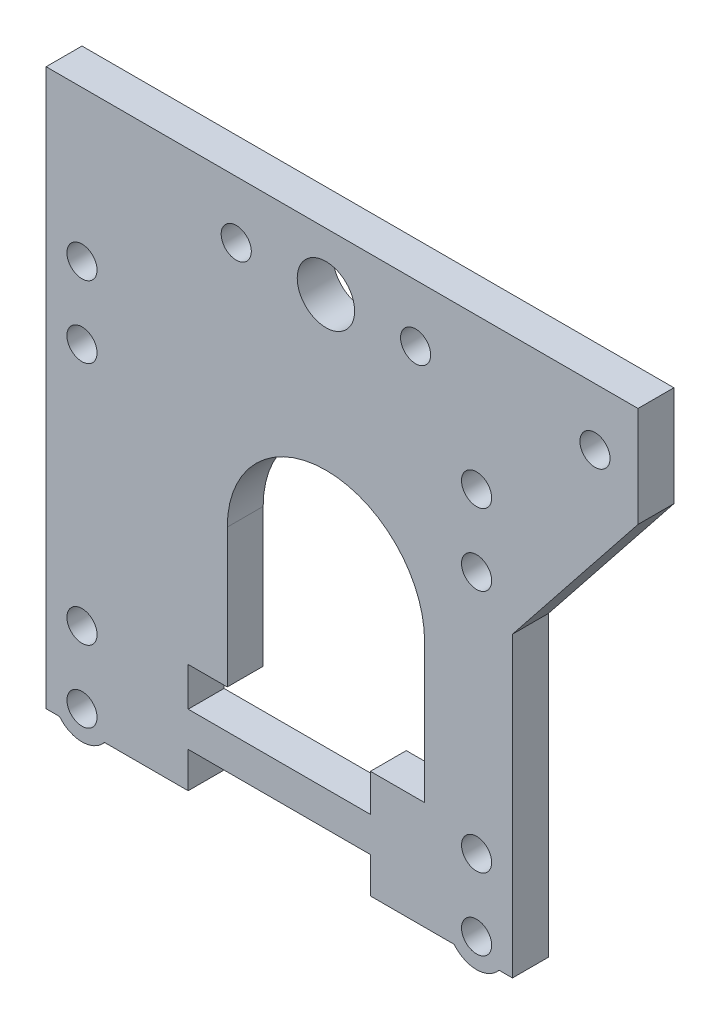
ISO-10303-21;
HEADER;
FILE_DESCRIPTION(('STEP AP214'),'2;1');
FILE_NAME('part.step','',(''),(''),'','','');
FILE_SCHEMA(('AUTOMOTIVE_DESIGN { 1 0 10303 214 1 1 1 1 }'));
ENDSEC;
DATA;
#1=APPLICATION_CONTEXT('core data for automotive mechanical design processes');
#2=APPLICATION_PROTOCOL_DEFINITION('international standard','automotive_design',2000,#1);
#3=PRODUCT_CONTEXT('',#1,'mechanical');
#4=PRODUCT('Part','Part','',(#3));
#5=PRODUCT_RELATED_PRODUCT_CATEGORY('part','',(#4));
#6=PRODUCT_DEFINITION_FORMATION('','',#4);
#7=PRODUCT_DEFINITION_CONTEXT('part definition',#1,'design');
#8=PRODUCT_DEFINITION('design','',#6,#7);
#9=PRODUCT_DEFINITION_SHAPE('','',#8);
#10=(LENGTH_UNIT() NAMED_UNIT(*) SI_UNIT(.MILLI.,.METRE.));
#11=(NAMED_UNIT(*) PLANE_ANGLE_UNIT() SI_UNIT($,.RADIAN.));
#12=(NAMED_UNIT(*) SI_UNIT($,.STERADIAN.) SOLID_ANGLE_UNIT());
#13=UNCERTAINTY_MEASURE_WITH_UNIT(LENGTH_MEASURE(1.E-05),#10,'distance_accuracy_value','');
#14=(GEOMETRIC_REPRESENTATION_CONTEXT(3) GLOBAL_UNCERTAINTY_ASSIGNED_CONTEXT((#13)) GLOBAL_UNIT_ASSIGNED_CONTEXT((#10,
#11,#12)) REPRESENTATION_CONTEXT('',''));
#15=CARTESIAN_POINT('',(0.,0.,0.));
#16=DIRECTION('',(0.,0.,1.));
#17=DIRECTION('',(1.,0.,0.));
#18=AXIS2_PLACEMENT_3D('',#15,#16,#17);
#19=CARTESIAN_POINT('',(-60.,2.5,5.));
#20=DIRECTION('',(0.,0.,1.));
#21=DIRECTION('',(1.,0.,0.));
#22=AXIS2_PLACEMENT_3D('',#19,#20,#21);
#23=PLANE('',#22);
#24=DIRECTION('',(0.,1.,0.));
#25=VECTOR('',#24,1.);
#26=CARTESIAN_POINT('',(-19.8,2.5,5.));
#27=LINE('',#26,#25);
#28=CARTESIAN_POINT('',(-19.8,0.,5.));
#29=VERTEX_POINT('',#28);
#30=CARTESIAN_POINT('',(-19.8,5.,5.));
#31=VERTEX_POINT('',#30);
#32=EDGE_CURVE('E433',#29,#31,#27,.T.);
#33=ORIENTED_EDGE('',*,*,#32,.F.);
#34=DIRECTION('',(1.,0.,0.));
#35=VECTOR('',#34,1.);
#36=CARTESIAN_POINT('',(-20.,0.,5.));
#37=LINE('',#36,#35);
#38=CARTESIAN_POINT('',(-8.12249899919918,0.,5.));
#39=VERTEX_POINT('',#38);
#40=EDGE_CURVE('E350',#29,#39,#37,.T.);
#41=ORIENTED_EDGE('',*,*,#40,.T.);
#42=CARTESIAN_POINT('',(-4.99999999999998,2.5,5.));
#43=DIRECTION('',(0.,0.,1.));
#44=DIRECTION('',(1.,0.,0.));
#45=AXIS2_PLACEMENT_3D('',#42,#43,#44);
#46=CIRCLE('',#45,4.);
#47=CARTESIAN_POINT('',(-1.87750100080077,0.,5.));
#48=VERTEX_POINT('',#47);
#49=EDGE_CURVE('E352',#39,#48,#46,.T.);
#50=ORIENTED_EDGE('',*,*,#49,.T.);
#51=DIRECTION('',(1.,0.,0.));
#52=VECTOR('',#51,1.);
#53=CARTESIAN_POINT('',(-1.87750100080077,0.,5.));
#54=LINE('',#53,#52);
#55=CARTESIAN_POINT('',(0.,0.,5.));
#56=VERTEX_POINT('',#55);
#57=EDGE_CURVE('E354',#48,#56,#54,.T.);
#58=ORIENTED_EDGE('',*,*,#57,.T.);
#59=DIRECTION('',(0.,1.,0.));
#60=VECTOR('',#59,1.);
#61=CARTESIAN_POINT('',(0.,61.5,5.));
#62=LINE('',#61,#60);
#63=CARTESIAN_POINT('',(0.,41.5,5.));
#64=VERTEX_POINT('',#63);
#65=EDGE_CURVE('E229',#56,#64,#62,.T.);
#66=ORIENTED_EDGE('',*,*,#65,.T.);
#67=DIRECTION('',(-0.622523565821538,-0.782601054175649,0.));
#68=VECTOR('',#67,1.);
#69=CARTESIAN_POINT('',(-7.63278329429795E-13,41.5,5.));
#70=LINE('',#69,#68);
#71=CARTESIAN_POINT('',(17.4999999999992,63.5,5.));
#72=VERTEX_POINT('',#71);
#73=EDGE_CURVE('E392',#72,#64,#70,.T.);
#74=ORIENTED_EDGE('',*,*,#73,.F.);
#75=DIRECTION('',(0.,-1.,0.));
#76=VECTOR('',#75,1.);
#77=CARTESIAN_POINT('',(17.4999999999992,63.5,5.));
#78=LINE('',#77,#76);
#79=CARTESIAN_POINT('',(17.4999999999984,77.4999999999999,5.));
#80=VERTEX_POINT('',#79);
#81=EDGE_CURVE('E401',#80,#72,#78,.T.);
#82=ORIENTED_EDGE('',*,*,#81,.F.);
#83=DIRECTION('',(1.,0.,0.));
#84=VECTOR('',#83,1.);
#85=CARTESIAN_POINT('',(-65.,77.4999999999999,5.));
#86=LINE('',#85,#84);
#87=CARTESIAN_POINT('',(-65.,77.4999999999999,5.));
#88=VERTEX_POINT('',#87);
#89=EDGE_CURVE('E371',#88,#80,#86,.T.);
#90=ORIENTED_EDGE('',*,*,#89,.F.);
#91=DIRECTION('',(0.,-1.,0.));
#92=VECTOR('',#91,1.);
#93=CARTESIAN_POINT('',(-65.,61.5,5.));
#94=LINE('',#93,#92);
#95=CARTESIAN_POINT('',(-65.,0.,5.));
#96=VERTEX_POINT('',#95);
#97=EDGE_CURVE('E224',#88,#96,#94,.T.);
#98=ORIENTED_EDGE('',*,*,#97,.T.);
#99=DIRECTION('',(1.,0.,0.));
#100=VECTOR('',#99,1.);
#101=CARTESIAN_POINT('',(-65.,0.,5.));
#102=LINE('',#101,#100);
#103=CARTESIAN_POINT('',(-63.1224989991992,0.,5.));
#104=VERTEX_POINT('',#103);
#105=EDGE_CURVE('E342',#96,#104,#102,.T.);
#106=ORIENTED_EDGE('',*,*,#105,.T.);
#107=CARTESIAN_POINT('',(-60.,2.5,5.));
#108=DIRECTION('',(0.,0.,1.));
#109=DIRECTION('',(1.,0.,0.));
#110=AXIS2_PLACEMENT_3D('',#107,#108,#109);
#111=CIRCLE('',#110,4.);
#112=CARTESIAN_POINT('',(-56.8775010008008,0.,5.));
#113=VERTEX_POINT('',#112);
#114=EDGE_CURVE('E344',#104,#113,#111,.T.);
#115=ORIENTED_EDGE('',*,*,#114,.T.);
#116=DIRECTION('',(1.,0.,0.));
#117=VECTOR('',#116,1.);
#118=CARTESIAN_POINT('',(-56.8775010008008,0.,5.));
#119=LINE('',#118,#117);
#120=CARTESIAN_POINT('',(-45.2,0.,5.));
#121=VERTEX_POINT('',#120);
#122=EDGE_CURVE('E346',#113,#121,#119,.T.);
#123=ORIENTED_EDGE('',*,*,#122,.T.);
#124=DIRECTION('',(0.,-1.,0.));
#125=VECTOR('',#124,1.);
#126=CARTESIAN_POINT('',(-45.2,2.5,5.));
#127=LINE('',#126,#125);
#128=CARTESIAN_POINT('',(-45.2,5.,5.));
#129=VERTEX_POINT('',#128);
#130=EDGE_CURVE('E188',#129,#121,#127,.T.);
#131=ORIENTED_EDGE('',*,*,#130,.F.);
#132=DIRECTION('',(1.,0.,0.));
#133=VECTOR('',#132,1.);
#134=CARTESIAN_POINT('',(-45.,5.,5.));
#135=LINE('',#134,#133);
#136=EDGE_CURVE('E348',#129,#31,#135,.T.);
#137=ORIENTED_EDGE('',*,*,#136,.T.);
#138=EDGE_LOOP('',(#33,#41,#50,#58,#66,#74,#82,#90,#98,#106,#115,#123,#131,#137));
#139=FACE_BOUND('',#138,.T.);
#140=DIRECTION('',(0.,1.,0.));
#141=VECTOR('',#140,1.);
#142=CARTESIAN_POINT('',(-19.8,2.5,5.));
#143=LINE('',#142,#141);
#144=CARTESIAN_POINT('',(-19.8,9.85,5.));
#145=VERTEX_POINT('',#144);
#146=CARTESIAN_POINT('',(-19.8,15.05,5.));
#147=VERTEX_POINT('',#146);
#148=EDGE_CURVE('E260',#145,#147,#143,.T.);
#149=ORIENTED_EDGE('',*,*,#148,.F.);
#150=DIRECTION('',(1.,0.,0.));
#151=VECTOR('',#150,1.);
#152=CARTESIAN_POINT('',(-60.,9.85000000000001,5.));
#153=LINE('',#152,#151);
#154=CARTESIAN_POINT('',(-45.2,9.85000000000001,5.));
#155=VERTEX_POINT('',#154);
#156=EDGE_CURVE('E430',#155,#145,#153,.T.);
#157=ORIENTED_EDGE('',*,*,#156,.F.);
#158=DIRECTION('',(0.,-1.,0.));
#159=VECTOR('',#158,1.);
#160=CARTESIAN_POINT('',(-45.2,2.5,5.));
#161=LINE('',#160,#159);
#162=CARTESIAN_POINT('',(-45.2,15.25,5.));
#163=VERTEX_POINT('',#162);
#164=EDGE_CURVE('E426',#163,#155,#161,.T.);
#165=ORIENTED_EDGE('',*,*,#164,.F.);
#166=DIRECTION('',(-1.,0.,0.));
#167=VECTOR('',#166,1.);
#168=CARTESIAN_POINT('',(-60.,15.25,5.));
#169=LINE('',#168,#167);
#170=CARTESIAN_POINT('',(-39.7500000000015,15.25,5.));
#171=VERTEX_POINT('',#170);
#172=EDGE_CURVE('E437',#171,#163,#169,.T.);
#173=ORIENTED_EDGE('',*,*,#172,.F.);
#174=DIRECTION('',(0.,1.,0.));
#175=VECTOR('',#174,1.);
#176=CARTESIAN_POINT('',(-39.7500000000015,15.05,5.));
#177=LINE('',#176,#175);
#178=CARTESIAN_POINT('',(-39.7500000000015,34.55,5.));
#179=VERTEX_POINT('',#178);
#180=EDGE_CURVE('E264',#171,#179,#177,.T.);
#181=ORIENTED_EDGE('',*,*,#180,.T.);
#182=CARTESIAN_POINT('',(-26.0000000000015,34.55,5.));
#183=DIRECTION('',(0.,0.,-1.));
#184=DIRECTION('',(-1.,0.,0.));
#185=AXIS2_PLACEMENT_3D('',#182,#183,#184);
#186=CIRCLE('',#185,13.75);
#187=CARTESIAN_POINT('',(-12.2500000000015,34.55,5.));
#188=VERTEX_POINT('',#187);
#189=EDGE_CURVE('E267',#179,#188,#186,.T.);
#190=ORIENTED_EDGE('',*,*,#189,.T.);
#191=DIRECTION('',(0.,-1.,0.));
#192=VECTOR('',#191,1.);
#193=CARTESIAN_POINT('',(-12.2500000000015,34.55,5.));
#194=LINE('',#193,#192);
#195=CARTESIAN_POINT('',(-12.2500000000015,15.05,5.));
#196=VERTEX_POINT('',#195);
#197=EDGE_CURVE('E263',#188,#196,#194,.T.);
#198=ORIENTED_EDGE('',*,*,#197,.T.);
#199=DIRECTION('',(-1.,0.,0.));
#200=VECTOR('',#199,1.);
#201=CARTESIAN_POINT('',(-39.7500000000015,15.05,5.));
#202=LINE('',#201,#200);
#203=EDGE_CURVE('E249',#196,#147,#202,.T.);
#204=ORIENTED_EDGE('',*,*,#203,.T.);
#205=EDGE_LOOP('',(#149,#157,#165,#173,#181,#190,#198,#204));
#206=FACE_BOUND('',#205,.T.);
#207=CARTESIAN_POINT('',(-60.,2.5,5.));
#208=DIRECTION('',(0.,0.,1.));
#209=DIRECTION('',(-1.,0.,0.));
#210=AXIS2_PLACEMENT_3D('',#207,#208,#209);
#211=CIRCLE('',#210,2.1);
#212=CARTESIAN_POINT('',(-62.1,2.5,5.));
#213=VERTEX_POINT('',#212);
#214=EDGE_CURVE('E298',#213,#213,#211,.T.);
#215=ORIENTED_EDGE('',*,*,#214,.F.);
#216=EDGE_LOOP('',(#215));
#217=FACE_BOUND('',#216,.T.);
#218=CARTESIAN_POINT('',(-4.99999999999998,12.5,5.));
#219=DIRECTION('',(0.,0.,1.));
#220=DIRECTION('',(-1.,0.,0.));
#221=AXIS2_PLACEMENT_3D('',#218,#219,#220);
#222=CIRCLE('',#221,2.1);
#223=CARTESIAN_POINT('',(-7.09999999999998,12.5,5.));
#224=VERTEX_POINT('',#223);
#225=EDGE_CURVE('E310',#224,#224,#222,.T.);
#226=ORIENTED_EDGE('',*,*,#225,.F.);
#227=EDGE_LOOP('',(#226));
#228=FACE_BOUND('',#227,.T.);
#229=CARTESIAN_POINT('',(-60.,46.5,5.));
#230=DIRECTION('',(0.,0.,1.));
#231=DIRECTION('',(1.,0.,0.));
#232=AXIS2_PLACEMENT_3D('',#229,#230,#231);
#233=CIRCLE('',#232,2.1);
#234=CARTESIAN_POINT('',(-57.9,46.5,5.));
#235=VERTEX_POINT('',#234);
#236=EDGE_CURVE('E322',#235,#235,#233,.T.);
#237=ORIENTED_EDGE('',*,*,#236,.F.);
#238=EDGE_LOOP('',(#237));
#239=FACE_BOUND('',#238,.T.);
#240=CARTESIAN_POINT('',(-60.,56.5,5.));
#241=DIRECTION('',(0.,0.,1.));
#242=DIRECTION('',(1.,0.,0.));
#243=AXIS2_PLACEMENT_3D('',#240,#241,#242);
#244=CIRCLE('',#243,2.1);
#245=CARTESIAN_POINT('',(-57.9,56.5,5.));
#246=VERTEX_POINT('',#245);
#247=EDGE_CURVE('E334',#246,#246,#244,.T.);
#248=ORIENTED_EDGE('',*,*,#247,.F.);
#249=EDGE_LOOP('',(#248));
#250=FACE_BOUND('',#249,.T.);
#251=CARTESIAN_POINT('',(-5.,56.5,5.));
#252=DIRECTION('',(0.,0.,1.));
#253=DIRECTION('',(1.,0.,0.));
#254=AXIS2_PLACEMENT_3D('',#251,#252,#253);
#255=CIRCLE('',#254,2.1);
#256=CARTESIAN_POINT('',(-2.90000000000001,56.5,5.));
#257=VERTEX_POINT('',#256);
#258=EDGE_CURVE('E328',#257,#257,#255,.T.);
#259=ORIENTED_EDGE('',*,*,#258,.F.);
#260=EDGE_LOOP('',(#259));
#261=FACE_BOUND('',#260,.T.);
#262=CARTESIAN_POINT('',(-5.,46.5,5.));
#263=DIRECTION('',(0.,0.,1.));
#264=DIRECTION('',(1.,0.,0.));
#265=AXIS2_PLACEMENT_3D('',#262,#263,#264);
#266=CIRCLE('',#265,2.1);
#267=CARTESIAN_POINT('',(-2.90000000000001,46.5,5.));
#268=VERTEX_POINT('',#267);
#269=EDGE_CURVE('E316',#268,#268,#266,.T.);
#270=ORIENTED_EDGE('',*,*,#269,.F.);
#271=EDGE_LOOP('',(#270));
#272=FACE_BOUND('',#271,.T.);
#273=CARTESIAN_POINT('',(-4.99999999999998,2.5,5.));
#274=DIRECTION('',(0.,0.,1.));
#275=DIRECTION('',(-1.,0.,0.));
#276=AXIS2_PLACEMENT_3D('',#273,#274,#275);
#277=CIRCLE('',#276,2.1);
#278=CARTESIAN_POINT('',(-7.09999999999998,2.5,5.));
#279=VERTEX_POINT('',#278);
#280=EDGE_CURVE('E304',#279,#279,#277,.T.);
#281=ORIENTED_EDGE('',*,*,#280,.F.);
#282=EDGE_LOOP('',(#281));
#283=FACE_BOUND('',#282,.T.);
#284=CARTESIAN_POINT('',(-60.,12.5,5.));
#285=DIRECTION('',(0.,0.,1.));
#286=DIRECTION('',(-1.,0.,0.));
#287=AXIS2_PLACEMENT_3D('',#284,#285,#286);
#288=CIRCLE('',#287,2.1);
#289=CARTESIAN_POINT('',(-62.1,12.5,5.));
#290=VERTEX_POINT('',#289);
#291=EDGE_CURVE('E292',#290,#290,#288,.T.);
#292=ORIENTED_EDGE('',*,*,#291,.F.);
#293=EDGE_LOOP('',(#292));
#294=FACE_BOUND('',#293,.T.);
#295=CARTESIAN_POINT('',(-38.5000000000018,69.4999999999999,5.));
#296=DIRECTION('',(0.,0.,-1.));
#297=DIRECTION('',(-1.,0.,0.));
#298=AXIS2_PLACEMENT_3D('',#295,#296,#297);
#299=CIRCLE('',#298,2.09999999999847);
#300=CARTESIAN_POINT('',(-40.6000000000002,69.4999999999999,5.));
#301=VERTEX_POINT('',#300);
#302=EDGE_CURVE('E420',#301,#301,#299,.T.);
#303=ORIENTED_EDGE('',*,*,#302,.T.);
#304=EDGE_LOOP('',(#303));
#305=FACE_BOUND('',#304,.T.);
#306=CARTESIAN_POINT('',(-26.0000000000014,69.4999999999999,5.));
#307=DIRECTION('',(0.,0.,-1.));
#308=DIRECTION('',(-1.,0.,0.));
#309=AXIS2_PLACEMENT_3D('',#306,#307,#308);
#310=CIRCLE('',#309,3.99999999999847);
#311=CARTESIAN_POINT('',(-29.9999999999999,69.4999999999999,5.));
#312=VERTEX_POINT('',#311);
#313=EDGE_CURVE('E414',#312,#312,#310,.T.);
#314=ORIENTED_EDGE('',*,*,#313,.T.);
#315=EDGE_LOOP('',(#314));
#316=FACE_BOUND('',#315,.T.);
#317=CARTESIAN_POINT('',(-13.5000000000018,69.4999999999999,5.));
#318=DIRECTION('',(0.,0.,-1.));
#319=DIRECTION('',(-1.,0.,0.));
#320=AXIS2_PLACEMENT_3D('',#317,#318,#319);
#321=CIRCLE('',#320,2.09999999999848);
#322=CARTESIAN_POINT('',(-15.6000000000002,69.4999999999999,5.));
#323=VERTEX_POINT('',#322);
#324=EDGE_CURVE('E409',#323,#323,#321,.T.);
#325=ORIENTED_EDGE('',*,*,#324,.T.);
#326=EDGE_LOOP('',(#325));
#327=FACE_BOUND('',#326,.T.);
#328=CARTESIAN_POINT('',(11.4999999999982,69.4999999999999,5.));
#329=DIRECTION('',(0.,0.,-1.));
#330=DIRECTION('',(-1.,0.,0.));
#331=AXIS2_PLACEMENT_3D('',#328,#329,#330);
#332=CIRCLE('',#331,2.09999999999848);
#333=CARTESIAN_POINT('',(9.39999999999977,69.4999999999999,5.));
#334=VERTEX_POINT('',#333);
#335=EDGE_CURVE('E384',#334,#334,#332,.T.);
#336=ORIENTED_EDGE('',*,*,#335,.T.);
#337=EDGE_LOOP('',(#336));
#338=FACE_BOUND('',#337,.T.);
#339=ADVANCED_FACE('F33',(#139,#206,#217,#228,#239,#250,#261,#272,#283,#294,#305,#316,#327,
#338),#23,.T.);
#340=CARTESIAN_POINT('',(-60.,2.5,0.));
#341=DIRECTION('',(0.,0.,1.));
#342=DIRECTION('',(1.,0.,0.));
#343=AXIS2_PLACEMENT_3D('',#340,#341,#342);
#344=PLANE('',#343);
#345=CARTESIAN_POINT('',(-60.,12.5,0.));
#346=DIRECTION('',(0.,0.,1.));
#347=DIRECTION('',(-1.,0.,0.));
#348=AXIS2_PLACEMENT_3D('',#345,#346,#347);
#349=CIRCLE('',#348,2.1);
#350=CARTESIAN_POINT('',(-62.1,12.5,0.));
#351=VERTEX_POINT('',#350);
#352=EDGE_CURVE('E287',#351,#351,#349,.T.);
#353=ORIENTED_EDGE('',*,*,#352,.T.);
#354=EDGE_LOOP('',(#353));
#355=FACE_BOUND('',#354,.T.);
#356=CARTESIAN_POINT('',(-60.,2.5,0.));
#357=DIRECTION('',(0.,0.,1.));
#358=DIRECTION('',(-1.,0.,0.));
#359=AXIS2_PLACEMENT_3D('',#356,#357,#358);
#360=CIRCLE('',#359,2.1);
#361=CARTESIAN_POINT('',(-62.1,2.5,0.));
#362=VERTEX_POINT('',#361);
#363=EDGE_CURVE('E295',#362,#362,#360,.T.);
#364=ORIENTED_EDGE('',*,*,#363,.T.);
#365=EDGE_LOOP('',(#364));
#366=FACE_BOUND('',#365,.T.);
#367=CARTESIAN_POINT('',(-4.99999999999998,2.5,0.));
#368=DIRECTION('',(0.,0.,1.));
#369=DIRECTION('',(-1.,0.,0.));
#370=AXIS2_PLACEMENT_3D('',#367,#368,#369);
#371=CIRCLE('',#370,2.1);
#372=CARTESIAN_POINT('',(-7.09999999999998,2.5,0.));
#373=VERTEX_POINT('',#372);
#374=EDGE_CURVE('E301',#373,#373,#371,.T.);
#375=ORIENTED_EDGE('',*,*,#374,.T.);
#376=EDGE_LOOP('',(#375));
#377=FACE_BOUND('',#376,.T.);
#378=CARTESIAN_POINT('',(-4.99999999999998,12.5,0.));
#379=DIRECTION('',(0.,0.,1.));
#380=DIRECTION('',(-1.,0.,0.));
#381=AXIS2_PLACEMENT_3D('',#378,#379,#380);
#382=CIRCLE('',#381,2.1);
#383=CARTESIAN_POINT('',(-7.09999999999998,12.5,0.));
#384=VERTEX_POINT('',#383);
#385=EDGE_CURVE('E307',#384,#384,#382,.T.);
#386=ORIENTED_EDGE('',*,*,#385,.T.);
#387=EDGE_LOOP('',(#386));
#388=FACE_BOUND('',#387,.T.);
#389=CARTESIAN_POINT('',(-5.,46.5,0.));
#390=DIRECTION('',(0.,0.,1.));
#391=DIRECTION('',(1.,0.,0.));
#392=AXIS2_PLACEMENT_3D('',#389,#390,#391);
#393=CIRCLE('',#392,2.1);
#394=CARTESIAN_POINT('',(-2.90000000000001,46.5,0.));
#395=VERTEX_POINT('',#394);
#396=EDGE_CURVE('E313',#395,#395,#393,.T.);
#397=ORIENTED_EDGE('',*,*,#396,.T.);
#398=EDGE_LOOP('',(#397));
#399=FACE_BOUND('',#398,.T.);
#400=CARTESIAN_POINT('',(-60.,46.5,0.));
#401=DIRECTION('',(0.,0.,1.));
#402=DIRECTION('',(1.,0.,0.));
#403=AXIS2_PLACEMENT_3D('',#400,#401,#402);
#404=CIRCLE('',#403,2.1);
#405=CARTESIAN_POINT('',(-57.9,46.5,0.));
#406=VERTEX_POINT('',#405);
#407=EDGE_CURVE('E319',#406,#406,#404,.T.);
#408=ORIENTED_EDGE('',*,*,#407,.T.);
#409=EDGE_LOOP('',(#408));
#410=FACE_BOUND('',#409,.T.);
#411=CARTESIAN_POINT('',(-5.,56.5,0.));
#412=DIRECTION('',(0.,0.,1.));
#413=DIRECTION('',(1.,0.,0.));
#414=AXIS2_PLACEMENT_3D('',#411,#412,#413);
#415=CIRCLE('',#414,2.1);
#416=CARTESIAN_POINT('',(-2.90000000000001,56.5,0.));
#417=VERTEX_POINT('',#416);
#418=EDGE_CURVE('E325',#417,#417,#415,.T.);
#419=ORIENTED_EDGE('',*,*,#418,.T.);
#420=EDGE_LOOP('',(#419));
#421=FACE_BOUND('',#420,.T.);
#422=CARTESIAN_POINT('',(-60.,56.5,0.));
#423=DIRECTION('',(0.,0.,1.));
#424=DIRECTION('',(1.,0.,0.));
#425=AXIS2_PLACEMENT_3D('',#422,#423,#424);
#426=CIRCLE('',#425,2.1);
#427=CARTESIAN_POINT('',(-57.9,56.5,0.));
#428=VERTEX_POINT('',#427);
#429=EDGE_CURVE('E331',#428,#428,#426,.T.);
#430=ORIENTED_EDGE('',*,*,#429,.T.);
#431=EDGE_LOOP('',(#430));
#432=FACE_BOUND('',#431,.T.);
#433=DIRECTION('',(1.,0.,0.));
#434=VECTOR('',#433,1.);
#435=CARTESIAN_POINT('',(-20.,0.,0.));
#436=LINE('',#435,#434);
#437=CARTESIAN_POINT('',(-19.8,0.,0.));
#438=VERTEX_POINT('',#437);
#439=CARTESIAN_POINT('',(-8.12249899919918,0.,0.));
#440=VERTEX_POINT('',#439);
#441=EDGE_CURVE('E211',#438,#440,#436,.T.);
#442=ORIENTED_EDGE('',*,*,#441,.F.);
#443=DIRECTION('',(0.,-1.,0.));
#444=VECTOR('',#443,1.);
#445=CARTESIAN_POINT('',(-19.8,5.,0.));
#446=LINE('',#445,#444);
#447=CARTESIAN_POINT('',(-19.8,5.,0.));
#448=VERTEX_POINT('',#447);
#449=EDGE_CURVE('E48',#448,#438,#446,.T.);
#450=ORIENTED_EDGE('',*,*,#449,.F.);
#451=DIRECTION('',(1.,0.,0.));
#452=VECTOR('',#451,1.);
#453=CARTESIAN_POINT('',(-45.,5.,0.));
#454=LINE('',#453,#452);
#455=CARTESIAN_POINT('',(-45.2,5.,0.));
#456=VERTEX_POINT('',#455);
#457=EDGE_CURVE('E202',#456,#448,#454,.T.);
#458=ORIENTED_EDGE('',*,*,#457,.F.);
#459=DIRECTION('',(0.,1.,0.));
#460=VECTOR('',#459,1.);
#461=CARTESIAN_POINT('',(-45.2,5.,0.));
#462=LINE('',#461,#460);
#463=CARTESIAN_POINT('',(-45.2,0.,0.));
#464=VERTEX_POINT('',#463);
#465=EDGE_CURVE('E186',#464,#456,#462,.T.);
#466=ORIENTED_EDGE('',*,*,#465,.F.);
#467=DIRECTION('',(1.,0.,0.));
#468=VECTOR('',#467,1.);
#469=CARTESIAN_POINT('',(-56.8775010008008,0.,0.));
#470=LINE('',#469,#468);
#471=CARTESIAN_POINT('',(-56.8775010008008,0.,0.));
#472=VERTEX_POINT('',#471);
#473=EDGE_CURVE('E201',#472,#464,#470,.T.);
#474=ORIENTED_EDGE('',*,*,#473,.F.);
#475=CARTESIAN_POINT('',(-60.,2.5,0.));
#476=DIRECTION('',(0.,0.,1.));
#477=DIRECTION('',(1.,0.,0.));
#478=AXIS2_PLACEMENT_3D('',#475,#476,#477);
#479=CIRCLE('',#478,4.);
#480=CARTESIAN_POINT('',(-63.1224989991992,0.,0.));
#481=VERTEX_POINT('',#480);
#482=EDGE_CURVE('E209',#481,#472,#479,.T.);
#483=ORIENTED_EDGE('',*,*,#482,.F.);
#484=DIRECTION('',(1.,0.,0.));
#485=VECTOR('',#484,1.);
#486=CARTESIAN_POINT('',(-65.,0.,0.));
#487=LINE('',#486,#485);
#488=CARTESIAN_POINT('',(-65.,0.,0.));
#489=VERTEX_POINT('',#488);
#490=EDGE_CURVE('E213',#489,#481,#487,.T.);
#491=ORIENTED_EDGE('',*,*,#490,.F.);
#492=DIRECTION('',(0.,-1.,0.));
#493=VECTOR('',#492,1.);
#494=CARTESIAN_POINT('',(-65.,61.5,0.));
#495=LINE('',#494,#493);
#496=CARTESIAN_POINT('',(-65.,77.4999999999999,0.));
#497=VERTEX_POINT('',#496);
#498=EDGE_CURVE('E337',#497,#489,#495,.T.);
#499=ORIENTED_EDGE('',*,*,#498,.F.);
#500=DIRECTION('',(1.,0.,0.));
#501=VECTOR('',#500,1.);
#502=CARTESIAN_POINT('',(-65.,77.4999999999999,0.));
#503=LINE('',#502,#501);
#504=CARTESIAN_POINT('',(17.4999999999984,77.4999999999999,0.));
#505=VERTEX_POINT('',#504);
#506=EDGE_CURVE('E378',#497,#505,#503,.T.);
#507=ORIENTED_EDGE('',*,*,#506,.T.);
#508=DIRECTION('',(0.,-1.,0.));
#509=VECTOR('',#508,1.);
#510=CARTESIAN_POINT('',(17.4999999999992,63.5,0.));
#511=LINE('',#510,#509);
#512=CARTESIAN_POINT('',(17.4999999999992,63.5,0.));
#513=VERTEX_POINT('',#512);
#514=EDGE_CURVE('E381',#505,#513,#511,.T.);
#515=ORIENTED_EDGE('',*,*,#514,.T.);
#516=DIRECTION('',(-0.622523565821538,-0.782601054175649,0.));
#517=VECTOR('',#516,1.);
#518=CARTESIAN_POINT('',(-7.63278329429795E-13,41.5,0.));
#519=LINE('',#518,#517);
#520=CARTESIAN_POINT('',(0.,41.5,0.));
#521=VERTEX_POINT('',#520);
#522=EDGE_CURVE('E386',#513,#521,#519,.T.);
#523=ORIENTED_EDGE('',*,*,#522,.T.);
#524=DIRECTION('',(0.,1.,0.));
#525=VECTOR('',#524,1.);
#526=CARTESIAN_POINT('',(0.,61.5,0.));
#527=LINE('',#526,#525);
#528=CARTESIAN_POINT('',(0.,0.,0.));
#529=VERTEX_POINT('',#528);
#530=EDGE_CURVE('E222',#529,#521,#527,.T.);
#531=ORIENTED_EDGE('',*,*,#530,.F.);
#532=DIRECTION('',(1.,0.,0.));
#533=VECTOR('',#532,1.);
#534=CARTESIAN_POINT('',(-1.87750100080077,0.,0.));
#535=LINE('',#534,#533);
#536=CARTESIAN_POINT('',(-1.87750100080077,0.,0.));
#537=VERTEX_POINT('',#536);
#538=EDGE_CURVE('E220',#537,#529,#535,.T.);
#539=ORIENTED_EDGE('',*,*,#538,.F.);
#540=CARTESIAN_POINT('',(-4.99999999999998,2.5,0.));
#541=DIRECTION('',(0.,0.,1.));
#542=DIRECTION('',(1.,0.,0.));
#543=AXIS2_PLACEMENT_3D('',#540,#541,#542);
#544=CIRCLE('',#543,4.);
#545=EDGE_CURVE('E218',#440,#537,#544,.T.);
#546=ORIENTED_EDGE('',*,*,#545,.F.);
#547=EDGE_LOOP('',(#442,#450,#458,#466,#474,#483,#491,#499,#507,#515,#523,#531,#539,#546));
#548=FACE_BOUND('',#547,.T.);
#549=DIRECTION('',(-1.,0.,0.));
#550=VECTOR('',#549,1.);
#551=CARTESIAN_POINT('',(-45.2,9.85000000000001,0.));
#552=LINE('',#551,#550);
#553=CARTESIAN_POINT('',(-19.8,9.85,0.));
#554=VERTEX_POINT('',#553);
#555=CARTESIAN_POINT('',(-45.2,9.85000000000001,0.));
#556=VERTEX_POINT('',#555);
#557=EDGE_CURVE('E443',#554,#556,#552,.T.);
#558=ORIENTED_EDGE('',*,*,#557,.F.);
#559=DIRECTION('',(0.,-1.,0.));
#560=VECTOR('',#559,1.);
#561=CARTESIAN_POINT('',(-19.8,15.25,0.));
#562=LINE('',#561,#560);
#563=CARTESIAN_POINT('',(-19.8,15.05,0.));
#564=VERTEX_POINT('',#563);
#565=EDGE_CURVE('E449',#564,#554,#562,.T.);
#566=ORIENTED_EDGE('',*,*,#565,.F.);
#567=DIRECTION('',(-1.,0.,0.));
#568=VECTOR('',#567,1.);
#569=CARTESIAN_POINT('',(-39.7500000000015,15.05,0.));
#570=LINE('',#569,#568);
#571=CARTESIAN_POINT('',(-12.2500000000015,15.05,0.));
#572=VERTEX_POINT('',#571);
#573=EDGE_CURVE('E252',#572,#564,#570,.T.);
#574=ORIENTED_EDGE('',*,*,#573,.F.);
#575=DIRECTION('',(0.,-1.,0.));
#576=VECTOR('',#575,1.);
#577=CARTESIAN_POINT('',(-12.2500000000015,34.55,0.));
#578=LINE('',#577,#576);
#579=CARTESIAN_POINT('',(-12.2500000000015,34.55,0.));
#580=VERTEX_POINT('',#579);
#581=EDGE_CURVE('E265',#580,#572,#578,.T.);
#582=ORIENTED_EDGE('',*,*,#581,.F.);
#583=CARTESIAN_POINT('',(-26.0000000000015,34.55,0.));
#584=DIRECTION('',(0.,0.,-1.));
#585=DIRECTION('',(-1.,0.,0.));
#586=AXIS2_PLACEMENT_3D('',#583,#584,#585);
#587=CIRCLE('',#586,13.75);
#588=CARTESIAN_POINT('',(-39.7500000000015,34.55,0.));
#589=VERTEX_POINT('',#588);
#590=EDGE_CURVE('E270',#589,#580,#587,.T.);
#591=ORIENTED_EDGE('',*,*,#590,.F.);
#592=DIRECTION('',(0.,1.,0.));
#593=VECTOR('',#592,1.);
#594=CARTESIAN_POINT('',(-39.7500000000015,15.05,0.));
#595=LINE('',#594,#593);
#596=CARTESIAN_POINT('',(-39.7500000000015,15.25,0.));
#597=VERTEX_POINT('',#596);
#598=EDGE_CURVE('E280',#597,#589,#595,.T.);
#599=ORIENTED_EDGE('',*,*,#598,.F.);
#600=DIRECTION('',(1.,0.,0.));
#601=VECTOR('',#600,1.);
#602=CARTESIAN_POINT('',(-45.2,15.25,0.));
#603=LINE('',#602,#601);
#604=CARTESIAN_POINT('',(-45.2,15.25,0.));
#605=VERTEX_POINT('',#604);
#606=EDGE_CURVE('E55',#605,#597,#603,.T.);
#607=ORIENTED_EDGE('',*,*,#606,.F.);
#608=DIRECTION('',(0.,1.,0.));
#609=VECTOR('',#608,1.);
#610=CARTESIAN_POINT('',(-45.2,15.25,0.));
#611=LINE('',#610,#609);
#612=EDGE_CURVE('E452',#556,#605,#611,.T.);
#613=ORIENTED_EDGE('',*,*,#612,.F.);
#614=EDGE_LOOP('',(#558,#566,#574,#582,#591,#599,#607,#613));
#615=FACE_BOUND('',#614,.T.);
#616=CARTESIAN_POINT('',(-38.5000000000018,69.4999999999999,0.));
#617=DIRECTION('',(0.,0.,-1.));
#618=DIRECTION('',(-1.,0.,0.));
#619=AXIS2_PLACEMENT_3D('',#616,#617,#618);
#620=CIRCLE('',#619,2.09999999999847);
#621=CARTESIAN_POINT('',(-40.6000000000002,69.4999999999999,0.));
#622=VERTEX_POINT('',#621);
#623=EDGE_CURVE('E423',#622,#622,#620,.T.);
#624=ORIENTED_EDGE('',*,*,#623,.F.);
#625=EDGE_LOOP('',(#624));
#626=FACE_BOUND('',#625,.T.);
#627=CARTESIAN_POINT('',(-26.0000000000014,69.4999999999999,0.));
#628=DIRECTION('',(0.,0.,-1.));
#629=DIRECTION('',(-1.,0.,0.));
#630=AXIS2_PLACEMENT_3D('',#627,#628,#629);
#631=CIRCLE('',#630,3.99999999999847);
#632=CARTESIAN_POINT('',(-29.9999999999999,69.4999999999999,0.));
#633=VERTEX_POINT('',#632);
#634=EDGE_CURVE('E417',#633,#633,#631,.T.);
#635=ORIENTED_EDGE('',*,*,#634,.F.);
#636=EDGE_LOOP('',(#635));
#637=FACE_BOUND('',#636,.T.);
#638=CARTESIAN_POINT('',(-13.5000000000018,69.4999999999999,0.));
#639=DIRECTION('',(0.,0.,-1.));
#640=DIRECTION('',(-1.,0.,0.));
#641=AXIS2_PLACEMENT_3D('',#638,#639,#640);
#642=CIRCLE('',#641,2.09999999999848);
#643=CARTESIAN_POINT('',(-15.6000000000002,69.4999999999999,0.));
#644=VERTEX_POINT('',#643);
#645=EDGE_CURVE('E411',#644,#644,#642,.T.);
#646=ORIENTED_EDGE('',*,*,#645,.F.);
#647=EDGE_LOOP('',(#646));
#648=FACE_BOUND('',#647,.T.);
#649=CARTESIAN_POINT('',(11.4999999999982,69.4999999999999,0.));
#650=DIRECTION('',(0.,0.,-1.));
#651=DIRECTION('',(-1.,0.,0.));
#652=AXIS2_PLACEMENT_3D('',#649,#650,#651);
#653=CIRCLE('',#652,2.09999999999848);
#654=CARTESIAN_POINT('',(9.39999999999977,69.4999999999999,0.));
#655=VERTEX_POINT('',#654);
#656=EDGE_CURVE('E389',#655,#655,#653,.T.);
#657=ORIENTED_EDGE('',*,*,#656,.F.);
#658=EDGE_LOOP('',(#657));
#659=FACE_BOUND('',#658,.T.);
#660=ADVANCED_FACE('F198',(#355,#366,#377,#388,#399,#410,#421,#432,#548,#615,#626,#637,#648,
#659),#344,.F.);
#661=CARTESIAN_POINT('',(-65.,61.5,5.));
#662=DIRECTION('',(1.,0.,0.));
#663=DIRECTION('',(0.,1.,0.));
#664=AXIS2_PLACEMENT_3D('',#661,#662,#663);
#665=PLANE('',#664);
#666=ORIENTED_EDGE('',*,*,#498,.T.);
#667=DIRECTION('',(0.,0.,-1.));
#668=VECTOR('',#667,1.);
#669=CARTESIAN_POINT('',(-65.,0.,5.));
#670=LINE('',#669,#668);
#671=EDGE_CURVE('E239',#96,#489,#670,.T.);
#672=ORIENTED_EDGE('',*,*,#671,.F.);
#673=ORIENTED_EDGE('',*,*,#97,.F.);
#674=DIRECTION('',(0.,0.,-1.));
#675=VECTOR('',#674,1.);
#676=CARTESIAN_POINT('',(-65.,77.4999999999999,5.));
#677=LINE('',#676,#675);
#678=EDGE_CURVE('E273',#88,#497,#677,.T.);
#679=ORIENTED_EDGE('',*,*,#678,.T.);
#680=EDGE_LOOP('',(#666,#672,#673,#679));
#681=FACE_BOUND('',#680,.T.);
#682=ADVANCED_FACE('F35',(#681),#665,.F.);
#683=CARTESIAN_POINT('',(-65.,0.,5.));
#684=DIRECTION('',(0.,1.,0.));
#685=DIRECTION('',(0.,0.,1.));
#686=AXIS2_PLACEMENT_3D('',#683,#684,#685);
#687=PLANE('',#686);
#688=ORIENTED_EDGE('',*,*,#490,.T.);
#689=DIRECTION('',(0.,0.,-1.));
#690=VECTOR('',#689,1.);
#691=CARTESIAN_POINT('',(-63.1224989991992,0.,5.));
#692=LINE('',#691,#690);
#693=EDGE_CURVE('E236',#104,#481,#692,.T.);
#694=ORIENTED_EDGE('',*,*,#693,.F.);
#695=ORIENTED_EDGE('',*,*,#105,.F.);
#696=ORIENTED_EDGE('',*,*,#671,.T.);
#697=EDGE_LOOP('',(#688,#694,#695,#696));
#698=FACE_BOUND('',#697,.T.);
#699=ADVANCED_FACE('F361',(#698),#687,.F.);
#700=CARTESIAN_POINT('',(-60.,2.5,5.));
#701=DIRECTION('',(0.,0.,-1.));
#702=DIRECTION('',(-1.,0.,0.));
#703=AXIS2_PLACEMENT_3D('',#700,#701,#702);
#704=CYLINDRICAL_SURFACE('',#703,4.);
#705=ORIENTED_EDGE('',*,*,#482,.T.);
#706=DIRECTION('',(0.,0.,-1.));
#707=VECTOR('',#706,1.);
#708=CARTESIAN_POINT('',(-56.8775010008008,0.,5.));
#709=LINE('',#708,#707);
#710=EDGE_CURVE('E208',#113,#472,#709,.T.);
#711=ORIENTED_EDGE('',*,*,#710,.F.);
#712=ORIENTED_EDGE('',*,*,#114,.F.);
#713=ORIENTED_EDGE('',*,*,#693,.T.);
#714=EDGE_LOOP('',(#705,#711,#712,#713));
#715=FACE_BOUND('',#714,.T.);
#716=ADVANCED_FACE('F365',(#715),#704,.T.);
#717=CARTESIAN_POINT('',(-56.8775010008008,0.,5.));
#718=DIRECTION('',(0.,1.,0.));
#719=DIRECTION('',(0.,0.,1.));
#720=AXIS2_PLACEMENT_3D('',#717,#718,#719);
#721=PLANE('',#720);
#722=ORIENTED_EDGE('',*,*,#473,.T.);
#723=DIRECTION('',(0.,0.,-1.));
#724=VECTOR('',#723,1.);
#725=CARTESIAN_POINT('',(-45.2,0.,10.));
#726=LINE('',#725,#724);
#727=EDGE_CURVE('E182',#121,#464,#726,.T.);
#728=ORIENTED_EDGE('',*,*,#727,.F.);
#729=ORIENTED_EDGE('',*,*,#122,.F.);
#730=ORIENTED_EDGE('',*,*,#710,.T.);
#731=EDGE_LOOP('',(#722,#728,#729,#730));
#732=FACE_BOUND('',#731,.T.);
#733=ADVANCED_FACE('F206',(#732),#721,.F.);
#734=CARTESIAN_POINT('',(-45.,5.,5.));
#735=DIRECTION('',(0.,1.,0.));
#736=DIRECTION('',(0.,0.,1.));
#737=AXIS2_PLACEMENT_3D('',#734,#735,#736);
#738=PLANE('',#737);
#739=ORIENTED_EDGE('',*,*,#457,.T.);
#740=DIRECTION('',(0.,0.,-1.));
#741=VECTOR('',#740,1.);
#742=CARTESIAN_POINT('',(-19.8,5.,10.));
#743=LINE('',#742,#741);
#744=EDGE_CURVE('E439',#31,#448,#743,.T.);
#745=ORIENTED_EDGE('',*,*,#744,.F.);
#746=ORIENTED_EDGE('',*,*,#136,.F.);
#747=DIRECTION('',(0.,0.,-1.));
#748=VECTOR('',#747,1.);
#749=CARTESIAN_POINT('',(-45.2,5.,10.));
#750=LINE('',#749,#748);
#751=EDGE_CURVE('E193',#129,#456,#750,.T.);
#752=ORIENTED_EDGE('',*,*,#751,.T.);
#753=EDGE_LOOP('',(#739,#745,#746,#752));
#754=FACE_BOUND('',#753,.T.);
#755=ADVANCED_FACE('F472',(#754),#738,.F.);
#756=CARTESIAN_POINT('',(-20.,0.,5.));
#757=DIRECTION('',(0.,1.,0.));
#758=DIRECTION('',(0.,0.,1.));
#759=AXIS2_PLACEMENT_3D('',#756,#757,#758);
#760=PLANE('',#759);
#761=ORIENTED_EDGE('',*,*,#40,.F.);
#762=DIRECTION('',(0.,0.,-1.));
#763=VECTOR('',#762,1.);
#764=CARTESIAN_POINT('',(-19.8,0.,5.));
#765=LINE('',#764,#763);
#766=EDGE_CURVE('E11',#29,#438,#765,.T.);
#767=ORIENTED_EDGE('',*,*,#766,.T.);
#768=ORIENTED_EDGE('',*,*,#441,.T.);
#769=DIRECTION('',(0.,0.,-1.));
#770=VECTOR('',#769,1.);
#771=CARTESIAN_POINT('',(-8.12249899919918,0.,5.));
#772=LINE('',#771,#770);
#773=EDGE_CURVE('E232',#39,#440,#772,.T.);
#774=ORIENTED_EDGE('',*,*,#773,.F.);
#775=EDGE_LOOP('',(#761,#767,#768,#774));
#776=FACE_BOUND('',#775,.T.);
#777=ADVANCED_FACE('F465',(#776),#760,.F.);
#778=CARTESIAN_POINT('',(-4.99999999999998,2.5,5.));
#779=DIRECTION('',(0.,0.,-1.));
#780=DIRECTION('',(-1.,0.,0.));
#781=AXIS2_PLACEMENT_3D('',#778,#779,#780);
#782=CYLINDRICAL_SURFACE('',#781,4.);
#783=ORIENTED_EDGE('',*,*,#545,.T.);
#784=DIRECTION('',(0.,0.,-1.));
#785=VECTOR('',#784,1.);
#786=CARTESIAN_POINT('',(-1.87750100080077,0.,5.));
#787=LINE('',#786,#785);
#788=EDGE_CURVE('E228',#48,#537,#787,.T.);
#789=ORIENTED_EDGE('',*,*,#788,.F.);
#790=ORIENTED_EDGE('',*,*,#49,.F.);
#791=ORIENTED_EDGE('',*,*,#773,.T.);
#792=EDGE_LOOP('',(#783,#789,#790,#791));
#793=FACE_BOUND('',#792,.T.);
#794=ADVANCED_FACE('F468',(#793),#782,.T.);
#795=CARTESIAN_POINT('',(-1.87750100080077,0.,5.));
#796=DIRECTION('',(0.,1.,0.));
#797=DIRECTION('',(0.,0.,1.));
#798=AXIS2_PLACEMENT_3D('',#795,#796,#797);
#799=PLANE('',#798);
#800=ORIENTED_EDGE('',*,*,#538,.T.);
#801=DIRECTION('',(0.,0.,-1.));
#802=VECTOR('',#801,1.);
#803=CARTESIAN_POINT('',(0.,0.,5.));
#804=LINE('',#803,#802);
#805=EDGE_CURVE('E225',#56,#529,#804,.T.);
#806=ORIENTED_EDGE('',*,*,#805,.F.);
#807=ORIENTED_EDGE('',*,*,#57,.F.);
#808=ORIENTED_EDGE('',*,*,#788,.T.);
#809=EDGE_LOOP('',(#800,#806,#807,#808));
#810=FACE_BOUND('',#809,.T.);
#811=ADVANCED_FACE('F495',(#810),#799,.F.);
#812=CARTESIAN_POINT('',(0.,61.5,5.));
#813=DIRECTION('',(-1.,0.,0.));
#814=DIRECTION('',(0.,0.,1.));
#815=AXIS2_PLACEMENT_3D('',#812,#813,#814);
#816=PLANE('',#815);
#817=ORIENTED_EDGE('',*,*,#530,.T.);
#818=DIRECTION('',(0.,0.,-1.));
#819=VECTOR('',#818,1.);
#820=CARTESIAN_POINT('',(-7.63278329429795E-13,41.5,5.));
#821=LINE('',#820,#819);
#822=EDGE_CURVE('E281',#64,#521,#821,.T.);
#823=ORIENTED_EDGE('',*,*,#822,.F.);
#824=ORIENTED_EDGE('',*,*,#65,.F.);
#825=ORIENTED_EDGE('',*,*,#805,.T.);
#826=EDGE_LOOP('',(#817,#823,#824,#825));
#827=FACE_BOUND('',#826,.T.);
#828=ADVANCED_FACE('F492',(#827),#816,.F.);
#829=CARTESIAN_POINT('',(-60.,56.5,5.));
#830=DIRECTION('',(0.,0.,-1.));
#831=DIRECTION('',(-1.,0.,0.));
#832=AXIS2_PLACEMENT_3D('',#829,#830,#831);
#833=CYLINDRICAL_SURFACE('',#832,2.1);
#834=ORIENTED_EDGE('',*,*,#247,.T.);
#835=EDGE_LOOP('',(#834));
#836=FACE_BOUND('',#835,.T.);
#837=ORIENTED_EDGE('',*,*,#429,.F.);
#838=EDGE_LOOP('',(#837));
#839=FACE_BOUND('',#838,.T.);
#840=ADVANCED_FACE('F489',(#836,#839),#833,.F.);
#841=CARTESIAN_POINT('',(-5.,56.5,5.));
#842=DIRECTION('',(0.,0.,-1.));
#843=DIRECTION('',(-1.,0.,0.));
#844=AXIS2_PLACEMENT_3D('',#841,#842,#843);
#845=CYLINDRICAL_SURFACE('',#844,2.1);
#846=ORIENTED_EDGE('',*,*,#258,.T.);
#847=EDGE_LOOP('',(#846));
#848=FACE_BOUND('',#847,.T.);
#849=ORIENTED_EDGE('',*,*,#418,.F.);
#850=EDGE_LOOP('',(#849));
#851=FACE_BOUND('',#850,.T.);
#852=ADVANCED_FACE('F522',(#848,#851),#845,.F.);
#853=CARTESIAN_POINT('',(-60.,46.5,5.));
#854=DIRECTION('',(0.,0.,-1.));
#855=DIRECTION('',(-1.,0.,0.));
#856=AXIS2_PLACEMENT_3D('',#853,#854,#855);
#857=CYLINDRICAL_SURFACE('',#856,2.1);
#858=ORIENTED_EDGE('',*,*,#236,.T.);
#859=EDGE_LOOP('',(#858));
#860=FACE_BOUND('',#859,.T.);
#861=ORIENTED_EDGE('',*,*,#407,.F.);
#862=EDGE_LOOP('',(#861));
#863=FACE_BOUND('',#862,.T.);
#864=ADVANCED_FACE('F529',(#860,#863),#857,.F.);
#865=CARTESIAN_POINT('',(-5.,46.5,5.));
#866=DIRECTION('',(0.,0.,-1.));
#867=DIRECTION('',(-1.,0.,0.));
#868=AXIS2_PLACEMENT_3D('',#865,#866,#867);
#869=CYLINDRICAL_SURFACE('',#868,2.1);
#870=ORIENTED_EDGE('',*,*,#269,.T.);
#871=EDGE_LOOP('',(#870));
#872=FACE_BOUND('',#871,.T.);
#873=ORIENTED_EDGE('',*,*,#396,.F.);
#874=EDGE_LOOP('',(#873));
#875=FACE_BOUND('',#874,.T.);
#876=ADVANCED_FACE('F536',(#872,#875),#869,.F.);
#877=CARTESIAN_POINT('',(-4.99999999999998,12.5,5.));
#878=DIRECTION('',(0.,0.,-1.));
#879=DIRECTION('',(-1.,0.,0.));
#880=AXIS2_PLACEMENT_3D('',#877,#878,#879);
#881=CYLINDRICAL_SURFACE('',#880,2.1);
#882=ORIENTED_EDGE('',*,*,#225,.T.);
#883=EDGE_LOOP('',(#882));
#884=FACE_BOUND('',#883,.T.);
#885=ORIENTED_EDGE('',*,*,#385,.F.);
#886=EDGE_LOOP('',(#885));
#887=FACE_BOUND('',#886,.T.);
#888=ADVANCED_FACE('F544',(#884,#887),#881,.F.);
#889=CARTESIAN_POINT('',(-4.99999999999998,2.5,5.));
#890=DIRECTION('',(0.,0.,-1.));
#891=DIRECTION('',(-1.,0.,0.));
#892=AXIS2_PLACEMENT_3D('',#889,#890,#891);
#893=CYLINDRICAL_SURFACE('',#892,2.1);
#894=ORIENTED_EDGE('',*,*,#280,.T.);
#895=EDGE_LOOP('',(#894));
#896=FACE_BOUND('',#895,.T.);
#897=ORIENTED_EDGE('',*,*,#374,.F.);
#898=EDGE_LOOP('',(#897));
#899=FACE_BOUND('',#898,.T.);
#900=ADVANCED_FACE('F552',(#896,#899),#893,.F.);
#901=CARTESIAN_POINT('',(-60.,2.5,5.));
#902=DIRECTION('',(0.,0.,-1.));
#903=DIRECTION('',(-1.,0.,0.));
#904=AXIS2_PLACEMENT_3D('',#901,#902,#903);
#905=CYLINDRICAL_SURFACE('',#904,2.1);
#906=ORIENTED_EDGE('',*,*,#214,.T.);
#907=EDGE_LOOP('',(#906));
#908=FACE_BOUND('',#907,.T.);
#909=ORIENTED_EDGE('',*,*,#363,.F.);
#910=EDGE_LOOP('',(#909));
#911=FACE_BOUND('',#910,.T.);
#912=ADVANCED_FACE('F560',(#908,#911),#905,.F.);
#913=CARTESIAN_POINT('',(-60.,12.5,5.));
#914=DIRECTION('',(0.,0.,-1.));
#915=DIRECTION('',(-1.,0.,0.));
#916=AXIS2_PLACEMENT_3D('',#913,#914,#915);
#917=CYLINDRICAL_SURFACE('',#916,2.1);
#918=ORIENTED_EDGE('',*,*,#291,.T.);
#919=EDGE_LOOP('',(#918));
#920=FACE_BOUND('',#919,.T.);
#921=ORIENTED_EDGE('',*,*,#352,.F.);
#922=EDGE_LOOP('',(#921));
#923=FACE_BOUND('',#922,.T.);
#924=ADVANCED_FACE('F568',(#920,#923),#917,.F.);
#925=CARTESIAN_POINT('',(-39.7500000000015,15.05,5.));
#926=DIRECTION('',(0.,-1.,0.));
#927=DIRECTION('',(0.,0.,-1.));
#928=AXIS2_PLACEMENT_3D('',#925,#926,#927);
#929=PLANE('',#928);
#930=ORIENTED_EDGE('',*,*,#573,.T.);
#931=DIRECTION('',(0.,0.,1.));
#932=VECTOR('',#931,1.);
#933=CARTESIAN_POINT('',(-19.8,15.05,5.));
#934=LINE('',#933,#932);
#935=EDGE_CURVE('E41',#564,#147,#934,.T.);
#936=ORIENTED_EDGE('',*,*,#935,.T.);
#937=ORIENTED_EDGE('',*,*,#203,.F.);
#938=DIRECTION('',(0.,0.,-1.));
#939=VECTOR('',#938,1.);
#940=CARTESIAN_POINT('',(-12.2500000000015,15.05,5.));
#941=LINE('',#940,#939);
#942=EDGE_CURVE('E285',#196,#572,#941,.T.);
#943=ORIENTED_EDGE('',*,*,#942,.T.);
#944=EDGE_LOOP('',(#930,#936,#937,#943));
#945=FACE_BOUND('',#944,.T.);
#946=ADVANCED_FACE('F248',(#945),#929,.F.);
#947=CARTESIAN_POINT('',(-12.2500000000015,34.55,5.));
#948=DIRECTION('',(1.,0.,0.));
#949=DIRECTION('',(0.,1.,0.));
#950=AXIS2_PLACEMENT_3D('',#947,#948,#949);
#951=PLANE('',#950);
#952=ORIENTED_EDGE('',*,*,#581,.T.);
#953=ORIENTED_EDGE('',*,*,#942,.F.);
#954=ORIENTED_EDGE('',*,*,#197,.F.);
#955=DIRECTION('',(0.,0.,-1.));
#956=VECTOR('',#955,1.);
#957=CARTESIAN_POINT('',(-12.2500000000015,34.55,5.));
#958=LINE('',#957,#956);
#959=EDGE_CURVE('E288',#188,#580,#958,.T.);
#960=ORIENTED_EDGE('',*,*,#959,.T.);
#961=EDGE_LOOP('',(#952,#953,#954,#960));
#962=FACE_BOUND('',#961,.T.);
#963=ADVANCED_FACE('F584',(#962),#951,.F.);
#964=CARTESIAN_POINT('',(-26.0000000000015,34.55,5.));
#965=DIRECTION('',(0.,0.,-1.));
#966=DIRECTION('',(-1.,0.,0.));
#967=AXIS2_PLACEMENT_3D('',#964,#965,#966);
#968=CYLINDRICAL_SURFACE('',#967,13.75);
#969=ORIENTED_EDGE('',*,*,#590,.T.);
#970=ORIENTED_EDGE('',*,*,#959,.F.);
#971=ORIENTED_EDGE('',*,*,#189,.F.);
#972=DIRECTION('',(0.,0.,-1.));
#973=VECTOR('',#972,1.);
#974=CARTESIAN_POINT('',(-39.7500000000015,34.55,5.));
#975=LINE('',#974,#973);
#976=EDGE_CURVE('E278',#179,#589,#975,.T.);
#977=ORIENTED_EDGE('',*,*,#976,.T.);
#978=EDGE_LOOP('',(#969,#970,#971,#977));
#979=FACE_BOUND('',#978,.T.);
#980=ADVANCED_FACE('F591',(#979),#968,.F.);
#981=CARTESIAN_POINT('',(-39.7500000000015,15.05,5.));
#982=DIRECTION('',(-1.,0.,0.));
#983=DIRECTION('',(0.,-1.,0.));
#984=AXIS2_PLACEMENT_3D('',#981,#982,#983);
#985=PLANE('',#984);
#986=ORIENTED_EDGE('',*,*,#180,.F.);
#987=DIRECTION('',(0.,0.,-1.));
#988=VECTOR('',#987,1.);
#989=CARTESIAN_POINT('',(-39.7500000000015,15.25,5.));
#990=LINE('',#989,#988);
#991=EDGE_CURVE('E242',#171,#597,#990,.T.);
#992=ORIENTED_EDGE('',*,*,#991,.T.);
#993=ORIENTED_EDGE('',*,*,#598,.T.);
#994=ORIENTED_EDGE('',*,*,#976,.F.);
#995=EDGE_LOOP('',(#986,#992,#993,#994));
#996=FACE_BOUND('',#995,.T.);
#997=ADVANCED_FACE('F599',(#996),#985,.F.);
#998=CARTESIAN_POINT('',(-7.63278329429795E-13,41.5,5.));
#999=DIRECTION('',(0.782601054175649,-0.622523565821538,0.));
#1000=DIRECTION('',(0.622523565821538,0.782601054175649,0.));
#1001=AXIS2_PLACEMENT_3D('',#998,#999,#1000);
#1002=PLANE('',#1001);
#1003=ORIENTED_EDGE('',*,*,#522,.F.);
#1004=DIRECTION('',(0.,0.,-1.));
#1005=VECTOR('',#1004,1.);
#1006=CARTESIAN_POINT('',(17.4999999999992,63.5,5.));
#1007=LINE('',#1006,#1005);
#1008=EDGE_CURVE('E398',#72,#513,#1007,.T.);
#1009=ORIENTED_EDGE('',*,*,#1008,.F.);
#1010=ORIENTED_EDGE('',*,*,#73,.T.);
#1011=ORIENTED_EDGE('',*,*,#822,.T.);
#1012=EDGE_LOOP('',(#1003,#1009,#1010,#1011));
#1013=FACE_BOUND('',#1012,.T.);
#1014=ADVANCED_FACE('F606',(#1013),#1002,.T.);
#1015=CARTESIAN_POINT('',(17.4999999999992,63.5,5.));
#1016=DIRECTION('',(1.,0.,0.));
#1017=DIRECTION('',(0.,1.,0.));
#1018=AXIS2_PLACEMENT_3D('',#1015,#1016,#1017);
#1019=PLANE('',#1018);
#1020=ORIENTED_EDGE('',*,*,#514,.F.);
#1021=DIRECTION('',(0.,0.,-1.));
#1022=VECTOR('',#1021,1.);
#1023=CARTESIAN_POINT('',(17.4999999999984,77.4999999999999,5.));
#1024=LINE('',#1023,#1022);
#1025=EDGE_CURVE('E399',#80,#505,#1024,.T.);
#1026=ORIENTED_EDGE('',*,*,#1025,.F.);
#1027=ORIENTED_EDGE('',*,*,#81,.T.);
#1028=ORIENTED_EDGE('',*,*,#1008,.T.);
#1029=EDGE_LOOP('',(#1020,#1026,#1027,#1028));
#1030=FACE_BOUND('',#1029,.T.);
#1031=ADVANCED_FACE('F614',(#1030),#1019,.T.);
#1032=CARTESIAN_POINT('',(-65.,77.4999999999999,5.));
#1033=DIRECTION('',(0.,1.,0.));
#1034=DIRECTION('',(-1.,0.,0.));
#1035=AXIS2_PLACEMENT_3D('',#1032,#1033,#1034);
#1036=PLANE('',#1035);
#1037=ORIENTED_EDGE('',*,*,#506,.F.);
#1038=ORIENTED_EDGE('',*,*,#678,.F.);
#1039=ORIENTED_EDGE('',*,*,#89,.T.);
#1040=ORIENTED_EDGE('',*,*,#1025,.T.);
#1041=EDGE_LOOP('',(#1037,#1038,#1039,#1040));
#1042=FACE_BOUND('',#1041,.T.);
#1043=ADVANCED_FACE('F621',(#1042),#1036,.T.);
#1044=CARTESIAN_POINT('',(11.4999999999982,69.4999999999999,5.));
#1045=DIRECTION('',(0.,0.,-1.));
#1046=DIRECTION('',(-1.,0.,0.));
#1047=AXIS2_PLACEMENT_3D('',#1044,#1045,#1046);
#1048=CYLINDRICAL_SURFACE('',#1047,2.09999999999848);
#1049=ORIENTED_EDGE('',*,*,#335,.F.);
#1050=EDGE_LOOP('',(#1049));
#1051=FACE_BOUND('',#1050,.T.);
#1052=ORIENTED_EDGE('',*,*,#656,.T.);
#1053=EDGE_LOOP('',(#1052));
#1054=FACE_BOUND('',#1053,.T.);
#1055=ADVANCED_FACE('F628',(#1051,#1054),#1048,.F.);
#1056=CARTESIAN_POINT('',(-13.5000000000018,69.4999999999999,5.));
#1057=DIRECTION('',(0.,0.,-1.));
#1058=DIRECTION('',(-1.,0.,0.));
#1059=AXIS2_PLACEMENT_3D('',#1056,#1057,#1058);
#1060=CYLINDRICAL_SURFACE('',#1059,2.09999999999848);
#1061=ORIENTED_EDGE('',*,*,#324,.F.);
#1062=EDGE_LOOP('',(#1061));
#1063=FACE_BOUND('',#1062,.T.);
#1064=ORIENTED_EDGE('',*,*,#645,.T.);
#1065=EDGE_LOOP('',(#1064));
#1066=FACE_BOUND('',#1065,.T.);
#1067=ADVANCED_FACE('F635',(#1063,#1066),#1060,.F.);
#1068=CARTESIAN_POINT('',(-26.0000000000014,69.4999999999999,5.));
#1069=DIRECTION('',(0.,0.,-1.));
#1070=DIRECTION('',(-1.,0.,0.));
#1071=AXIS2_PLACEMENT_3D('',#1068,#1069,#1070);
#1072=CYLINDRICAL_SURFACE('',#1071,3.99999999999847);
#1073=ORIENTED_EDGE('',*,*,#313,.F.);
#1074=EDGE_LOOP('',(#1073));
#1075=FACE_BOUND('',#1074,.T.);
#1076=ORIENTED_EDGE('',*,*,#634,.T.);
#1077=EDGE_LOOP('',(#1076));
#1078=FACE_BOUND('',#1077,.T.);
#1079=ADVANCED_FACE('F643',(#1075,#1078),#1072,.F.);
#1080=CARTESIAN_POINT('',(-38.5000000000018,69.4999999999999,5.));
#1081=DIRECTION('',(0.,0.,-1.));
#1082=DIRECTION('',(-1.,0.,0.));
#1083=AXIS2_PLACEMENT_3D('',#1080,#1081,#1082);
#1084=CYLINDRICAL_SURFACE('',#1083,2.09999999999847);
#1085=ORIENTED_EDGE('',*,*,#302,.F.);
#1086=EDGE_LOOP('',(#1085));
#1087=FACE_BOUND('',#1086,.T.);
#1088=ORIENTED_EDGE('',*,*,#623,.T.);
#1089=EDGE_LOOP('',(#1088));
#1090=FACE_BOUND('',#1089,.T.);
#1091=ADVANCED_FACE('F651',(#1087,#1090),#1084,.F.);
#1092=CARTESIAN_POINT('',(-45.2,15.25,10.));
#1093=DIRECTION('',(-1.,0.,0.));
#1094=DIRECTION('',(0.,0.,1.));
#1095=AXIS2_PLACEMENT_3D('',#1092,#1093,#1094);
#1096=PLANE('',#1095);
#1097=ORIENTED_EDGE('',*,*,#164,.T.);
#1098=DIRECTION('',(0.,0.,-1.));
#1099=VECTOR('',#1098,1.);
#1100=CARTESIAN_POINT('',(-45.2,9.85000000000001,10.));
#1101=LINE('',#1100,#1099);
#1102=EDGE_CURVE('E445',#155,#556,#1101,.T.);
#1103=ORIENTED_EDGE('',*,*,#1102,.T.);
#1104=ORIENTED_EDGE('',*,*,#612,.T.);
#1105=DIRECTION('',(0.,0.,-1.));
#1106=VECTOR('',#1105,1.);
#1107=CARTESIAN_POINT('',(-45.2,15.25,10.));
#1108=LINE('',#1107,#1106);
#1109=EDGE_CURVE('E440',#163,#605,#1108,.T.);
#1110=ORIENTED_EDGE('',*,*,#1109,.F.);
#1111=EDGE_LOOP('',(#1097,#1103,#1104,#1110));
#1112=FACE_BOUND('',#1111,.T.);
#1113=ADVANCED_FACE('F659',(#1112),#1096,.F.);
#1114=CARTESIAN_POINT('',(-45.2,9.85000000000001,10.));
#1115=DIRECTION('',(0.,-1.,0.));
#1116=DIRECTION('',(1.,0.,0.));
#1117=AXIS2_PLACEMENT_3D('',#1114,#1115,#1116);
#1118=PLANE('',#1117);
#1119=ORIENTED_EDGE('',*,*,#156,.T.);
#1120=DIRECTION('',(0.,0.,-1.));
#1121=VECTOR('',#1120,1.);
#1122=CARTESIAN_POINT('',(-19.8,9.85,10.));
#1123=LINE('',#1122,#1121);
#1124=EDGE_CURVE('E442',#145,#554,#1123,.T.);
#1125=ORIENTED_EDGE('',*,*,#1124,.T.);
#1126=ORIENTED_EDGE('',*,*,#557,.T.);
#1127=ORIENTED_EDGE('',*,*,#1102,.F.);
#1128=EDGE_LOOP('',(#1119,#1125,#1126,#1127));
#1129=FACE_BOUND('',#1128,.T.);
#1130=ADVANCED_FACE('F666',(#1129),#1118,.F.);
#1131=CARTESIAN_POINT('',(-19.8,15.25,10.));
#1132=DIRECTION('',(1.,0.,0.));
#1133=DIRECTION('',(0.,0.,-1.));
#1134=AXIS2_PLACEMENT_3D('',#1131,#1132,#1133);
#1135=PLANE('',#1134);
#1136=ORIENTED_EDGE('',*,*,#148,.T.);
#1137=ORIENTED_EDGE('',*,*,#935,.F.);
#1138=ORIENTED_EDGE('',*,*,#565,.T.);
#1139=ORIENTED_EDGE('',*,*,#1124,.F.);
#1140=EDGE_LOOP('',(#1136,#1137,#1138,#1139));
#1141=FACE_BOUND('',#1140,.T.);
#1142=ADVANCED_FACE('F674',(#1141),#1135,.F.);
#1143=CARTESIAN_POINT('',(-45.2,15.25,10.));
#1144=DIRECTION('',(0.,1.,0.));
#1145=DIRECTION('',(-1.,0.,0.));
#1146=AXIS2_PLACEMENT_3D('',#1143,#1144,#1145);
#1147=PLANE('',#1146);
#1148=ORIENTED_EDGE('',*,*,#172,.T.);
#1149=ORIENTED_EDGE('',*,*,#1109,.T.);
#1150=ORIENTED_EDGE('',*,*,#606,.T.);
#1151=ORIENTED_EDGE('',*,*,#991,.F.);
#1152=EDGE_LOOP('',(#1148,#1149,#1150,#1151));
#1153=FACE_BOUND('',#1152,.T.);
#1154=ADVANCED_FACE('F682',(#1153),#1147,.F.);
#1155=CARTESIAN_POINT('',(-19.8,5.,10.));
#1156=DIRECTION('',(1.,0.,0.));
#1157=DIRECTION('',(0.,0.,-1.));
#1158=AXIS2_PLACEMENT_3D('',#1155,#1156,#1157);
#1159=PLANE('',#1158);
#1160=ORIENTED_EDGE('',*,*,#32,.T.);
#1161=ORIENTED_EDGE('',*,*,#744,.T.);
#1162=ORIENTED_EDGE('',*,*,#449,.T.);
#1163=ORIENTED_EDGE('',*,*,#766,.F.);
#1164=EDGE_LOOP('',(#1160,#1161,#1162,#1163));
#1165=FACE_BOUND('',#1164,.T.);
#1166=ADVANCED_FACE('F458',(#1165),#1159,.F.);
#1167=CARTESIAN_POINT('',(-45.2,5.,10.));
#1168=DIRECTION('',(-1.,0.,0.));
#1169=DIRECTION('',(0.,0.,1.));
#1170=AXIS2_PLACEMENT_3D('',#1167,#1168,#1169);
#1171=PLANE('',#1170);
#1172=ORIENTED_EDGE('',*,*,#130,.T.);
#1173=ORIENTED_EDGE('',*,*,#727,.T.);
#1174=ORIENTED_EDGE('',*,*,#465,.T.);
#1175=ORIENTED_EDGE('',*,*,#751,.F.);
#1176=EDGE_LOOP('',(#1172,#1173,#1174,#1175));
#1177=FACE_BOUND('',#1176,.T.);
#1178=ADVANCED_FACE('F184',(#1177),#1171,.F.);
#1179=CLOSED_SHELL('',(#339,#660,#682,#699,#716,#733,#755,#777,#794,#811,#828,#840,#852,#864,
#876,#888,#900,#912,#924,#946,#963,#980,#997,#1014,#1031,#1043,#1055,#1067,#1079,#1091,#1113,
#1130,#1142,#1154,#1166,#1178));
#1180=MANIFOLD_SOLID_BREP('B2',#1179);
#1181=ADVANCED_BREP_SHAPE_REPRESENTATION('',(#18,#1180),#14);
#1182=SHAPE_DEFINITION_REPRESENTATION(#9,#1181);
ENDSEC;
END-ISO-10303-21;
